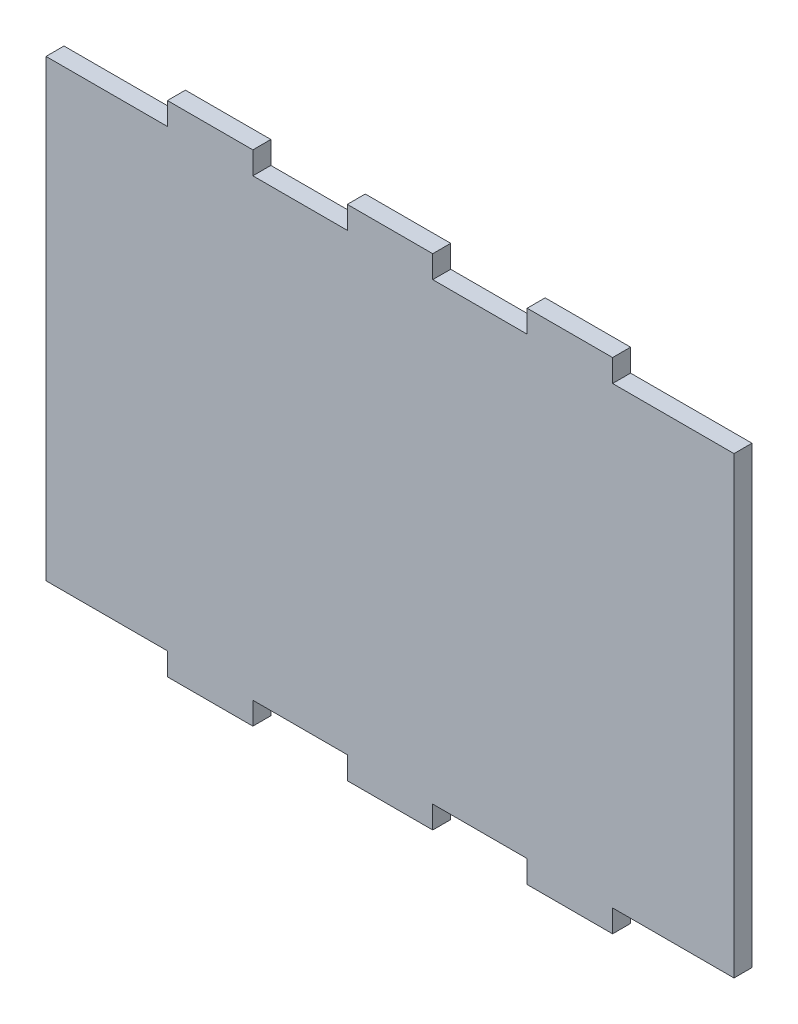
ISO-10303-21;
HEADER;
FILE_DESCRIPTION(('STEP AP214'),'2;1');
FILE_NAME('part.step','',(''),(''),'','','');
FILE_SCHEMA(('AUTOMOTIVE_DESIGN { 1 0 10303 214 1 1 1 1 }'));
ENDSEC;
DATA;
#1=APPLICATION_CONTEXT('core data for automotive mechanical design processes');
#2=APPLICATION_PROTOCOL_DEFINITION('international standard','automotive_design',2000,#1);
#3=PRODUCT_CONTEXT('',#1,'mechanical');
#4=PRODUCT('Part','Part','',(#3));
#5=PRODUCT_RELATED_PRODUCT_CATEGORY('part','',(#4));
#6=PRODUCT_DEFINITION_FORMATION('','',#4);
#7=PRODUCT_DEFINITION_CONTEXT('part definition',#1,'design');
#8=PRODUCT_DEFINITION('design','',#6,#7);
#9=PRODUCT_DEFINITION_SHAPE('','',#8);
#10=(LENGTH_UNIT() NAMED_UNIT(*) SI_UNIT(.MILLI.,.METRE.));
#11=(NAMED_UNIT(*) PLANE_ANGLE_UNIT() SI_UNIT($,.RADIAN.));
#12=(NAMED_UNIT(*) SI_UNIT($,.STERADIAN.) SOLID_ANGLE_UNIT());
#13=UNCERTAINTY_MEASURE_WITH_UNIT(LENGTH_MEASURE(1.E-05),#10,'distance_accuracy_value','');
#14=(GEOMETRIC_REPRESENTATION_CONTEXT(3) GLOBAL_UNCERTAINTY_ASSIGNED_CONTEXT((#13)) GLOBAL_UNIT_ASSIGNED_CONTEXT((#10,
#11,#12)) REPRESENTATION_CONTEXT('',''));
#15=CARTESIAN_POINT('',(0.,0.,0.));
#16=DIRECTION('',(0.,0.,1.));
#17=DIRECTION('',(1.,0.,0.));
#18=AXIS2_PLACEMENT_3D('',#15,#16,#17);
#19=CARTESIAN_POINT('',(-38.25,25.25,2.));
#20=DIRECTION('',(0.,1.,0.));
#21=DIRECTION('',(-1.,0.,0.));
#22=AXIS2_PLACEMENT_3D('',#19,#20,#21);
#23=PLANE('',#22);
#24=DIRECTION('',(1.,0.,0.));
#25=VECTOR('',#24,1.);
#26=CARTESIAN_POINT('',(-38.25,25.25,0.));
#27=LINE('',#26,#25);
#28=CARTESIAN_POINT('',(-38.25,25.25,0.));
#29=VERTEX_POINT('',#28);
#30=CARTESIAN_POINT('',(-24.75,25.25,0.));
#31=VERTEX_POINT('',#30);
#32=EDGE_CURVE('E251',#29,#31,#27,.T.);
#33=ORIENTED_EDGE('',*,*,#32,.F.);
#34=DIRECTION('',(0.,0.,-1.));
#35=VECTOR('',#34,1.);
#36=CARTESIAN_POINT('',(-38.25,25.25,2.));
#37=LINE('',#36,#35);
#38=CARTESIAN_POINT('',(-38.25,25.25,2.));
#39=VERTEX_POINT('',#38);
#40=EDGE_CURVE('E11',#39,#29,#37,.T.);
#41=ORIENTED_EDGE('',*,*,#40,.F.);
#42=DIRECTION('',(1.,0.,0.));
#43=VECTOR('',#42,1.);
#44=CARTESIAN_POINT('',(-38.25,25.25,2.));
#45=LINE('',#44,#43);
#46=CARTESIAN_POINT('',(-24.75,25.25,2.));
#47=VERTEX_POINT('',#46);
#48=EDGE_CURVE('E324',#39,#47,#45,.T.);
#49=ORIENTED_EDGE('',*,*,#48,.T.);
#50=DIRECTION('',(0.,0.,-1.));
#51=VECTOR('',#50,1.);
#52=CARTESIAN_POINT('',(-24.75,25.25,2.));
#53=LINE('',#52,#51);
#54=EDGE_CURVE('E36',#47,#31,#53,.T.);
#55=ORIENTED_EDGE('',*,*,#54,.T.);
#56=EDGE_LOOP('',(#33,#41,#49,#55));
#57=FACE_BOUND('',#56,.T.);
#58=ADVANCED_FACE('F33',(#57),#23,.T.);
#59=CARTESIAN_POINT('',(-38.25,25.25,2.));
#60=DIRECTION('',(1.,0.,0.));
#61=DIRECTION('',(0.,0.,-1.));
#62=AXIS2_PLACEMENT_3D('',#59,#60,#61);
#63=PLANE('',#62);
#64=DIRECTION('',(0.,-1.,0.));
#65=VECTOR('',#64,1.);
#66=CARTESIAN_POINT('',(-38.25,25.25,0.));
#67=LINE('',#66,#65);
#68=CARTESIAN_POINT('',(-38.25,-25.25,0.));
#69=VERTEX_POINT('',#68);
#70=EDGE_CURVE('E138',#29,#69,#67,.T.);
#71=ORIENTED_EDGE('',*,*,#70,.T.);
#72=DIRECTION('',(0.,0.,-1.));
#73=VECTOR('',#72,1.);
#74=CARTESIAN_POINT('',(-38.25,-25.25,2.));
#75=LINE('',#74,#73);
#76=CARTESIAN_POINT('',(-38.25,-25.25,2.));
#77=VERTEX_POINT('',#76);
#78=EDGE_CURVE('E42',#77,#69,#75,.T.);
#79=ORIENTED_EDGE('',*,*,#78,.F.);
#80=DIRECTION('',(0.,-1.,0.));
#81=VECTOR('',#80,1.);
#82=CARTESIAN_POINT('',(-38.25,25.25,2.));
#83=LINE('',#82,#81);
#84=EDGE_CURVE('E229',#39,#77,#83,.T.);
#85=ORIENTED_EDGE('',*,*,#84,.F.);
#86=ORIENTED_EDGE('',*,*,#40,.T.);
#87=EDGE_LOOP('',(#71,#79,#85,#86));
#88=FACE_BOUND('',#87,.T.);
#89=ADVANCED_FACE('F546',(#88),#63,.F.);
#90=CARTESIAN_POINT('',(-38.25,-25.25,2.));
#91=DIRECTION('',(0.,1.,0.));
#92=DIRECTION('',(-1.,0.,0.));
#93=AXIS2_PLACEMENT_3D('',#90,#91,#92);
#94=PLANE('',#93);
#95=DIRECTION('',(1.,0.,0.));
#96=VECTOR('',#95,1.);
#97=CARTESIAN_POINT('',(-38.25,-25.25,0.));
#98=LINE('',#97,#96);
#99=CARTESIAN_POINT('',(-24.75,-25.25,0.));
#100=VERTEX_POINT('',#99);
#101=EDGE_CURVE('E236',#69,#100,#98,.T.);
#102=ORIENTED_EDGE('',*,*,#101,.T.);
#103=DIRECTION('',(0.,0.,-1.));
#104=VECTOR('',#103,1.);
#105=CARTESIAN_POINT('',(-24.75,-25.25,2.));
#106=LINE('',#105,#104);
#107=CARTESIAN_POINT('',(-24.75,-25.25,2.));
#108=VERTEX_POINT('',#107);
#109=EDGE_CURVE('E233',#108,#100,#106,.T.);
#110=ORIENTED_EDGE('',*,*,#109,.F.);
#111=DIRECTION('',(1.,0.,0.));
#112=VECTOR('',#111,1.);
#113=CARTESIAN_POINT('',(-38.25,-25.25,2.));
#114=LINE('',#113,#112);
#115=EDGE_CURVE('E222',#77,#108,#114,.T.);
#116=ORIENTED_EDGE('',*,*,#115,.F.);
#117=ORIENTED_EDGE('',*,*,#78,.T.);
#118=EDGE_LOOP('',(#102,#110,#116,#117));
#119=FACE_BOUND('',#118,.T.);
#120=ADVANCED_FACE('F234',(#119),#94,.F.);
#121=CARTESIAN_POINT('',(-24.75,-25.25,2.));
#122=DIRECTION('',(1.,0.,0.));
#123=DIRECTION('',(0.,0.,-1.));
#124=AXIS2_PLACEMENT_3D('',#121,#122,#123);
#125=PLANE('',#124);
#126=DIRECTION('',(0.,-1.,0.));
#127=VECTOR('',#126,1.);
#128=CARTESIAN_POINT('',(-24.75,-25.25,0.));
#129=LINE('',#128,#127);
#130=CARTESIAN_POINT('',(-24.75,-27.75,0.));
#131=VERTEX_POINT('',#130);
#132=EDGE_CURVE('E321',#100,#131,#129,.T.);
#133=ORIENTED_EDGE('',*,*,#132,.T.);
#134=DIRECTION('',(0.,0.,-1.));
#135=VECTOR('',#134,1.);
#136=CARTESIAN_POINT('',(-24.75,-27.75,2.));
#137=LINE('',#136,#135);
#138=CARTESIAN_POINT('',(-24.75,-27.75,2.));
#139=VERTEX_POINT('',#138);
#140=EDGE_CURVE('E239',#139,#131,#137,.T.);
#141=ORIENTED_EDGE('',*,*,#140,.F.);
#142=DIRECTION('',(0.,-1.,0.));
#143=VECTOR('',#142,1.);
#144=CARTESIAN_POINT('',(-24.75,-25.25,2.));
#145=LINE('',#144,#143);
#146=EDGE_CURVE('E227',#108,#139,#145,.T.);
#147=ORIENTED_EDGE('',*,*,#146,.F.);
#148=ORIENTED_EDGE('',*,*,#109,.T.);
#149=EDGE_LOOP('',(#133,#141,#147,#148));
#150=FACE_BOUND('',#149,.T.);
#151=ADVANCED_FACE('F241',(#150),#125,.F.);
#152=CARTESIAN_POINT('',(-24.75,-27.75,2.));
#153=DIRECTION('',(0.,1.,0.));
#154=DIRECTION('',(-1.,0.,0.));
#155=AXIS2_PLACEMENT_3D('',#152,#153,#154);
#156=PLANE('',#155);
#157=DIRECTION('',(1.,0.,0.));
#158=VECTOR('',#157,1.);
#159=CARTESIAN_POINT('',(-24.75,-27.75,0.));
#160=LINE('',#159,#158);
#161=CARTESIAN_POINT('',(-15.25,-27.75,0.));
#162=VERTEX_POINT('',#161);
#163=EDGE_CURVE('E318',#131,#162,#160,.T.);
#164=ORIENTED_EDGE('',*,*,#163,.T.);
#165=DIRECTION('',(0.,0.,-1.));
#166=VECTOR('',#165,1.);
#167=CARTESIAN_POINT('',(-15.25,-27.75,2.));
#168=LINE('',#167,#166);
#169=CARTESIAN_POINT('',(-15.25,-27.75,2.));
#170=VERTEX_POINT('',#169);
#171=EDGE_CURVE('E328',#170,#162,#168,.T.);
#172=ORIENTED_EDGE('',*,*,#171,.F.);
#173=DIRECTION('',(1.,0.,0.));
#174=VECTOR('',#173,1.);
#175=CARTESIAN_POINT('',(-24.75,-27.75,2.));
#176=LINE('',#175,#174);
#177=EDGE_CURVE('E244',#139,#170,#176,.T.);
#178=ORIENTED_EDGE('',*,*,#177,.F.);
#179=ORIENTED_EDGE('',*,*,#140,.T.);
#180=EDGE_LOOP('',(#164,#172,#178,#179));
#181=FACE_BOUND('',#180,.T.);
#182=ADVANCED_FACE('F383',(#181),#156,.F.);
#183=CARTESIAN_POINT('',(-15.25,-25.25,2.));
#184=DIRECTION('',(1.,0.,0.));
#185=DIRECTION('',(0.,1.,0.));
#186=AXIS2_PLACEMENT_3D('',#183,#184,#185);
#187=PLANE('',#186);
#188=DIRECTION('',(0.,-1.,0.));
#189=VECTOR('',#188,1.);
#190=CARTESIAN_POINT('',(-15.25,-25.25,0.));
#191=LINE('',#190,#189);
#192=CARTESIAN_POINT('',(-15.25,-25.25,0.));
#193=VERTEX_POINT('',#192);
#194=EDGE_CURVE('E315',#193,#162,#191,.T.);
#195=ORIENTED_EDGE('',*,*,#194,.F.);
#196=DIRECTION('',(0.,0.,-1.));
#197=VECTOR('',#196,1.);
#198=CARTESIAN_POINT('',(-15.25,-25.25,2.));
#199=LINE('',#198,#197);
#200=CARTESIAN_POINT('',(-15.25,-25.25,2.));
#201=VERTEX_POINT('',#200);
#202=EDGE_CURVE('E330',#201,#193,#199,.T.);
#203=ORIENTED_EDGE('',*,*,#202,.F.);
#204=DIRECTION('',(0.,-1.,0.));
#205=VECTOR('',#204,1.);
#206=CARTESIAN_POINT('',(-15.25,-25.25,2.));
#207=LINE('',#206,#205);
#208=EDGE_CURVE('E246',#201,#170,#207,.T.);
#209=ORIENTED_EDGE('',*,*,#208,.T.);
#210=ORIENTED_EDGE('',*,*,#171,.T.);
#211=EDGE_LOOP('',(#195,#203,#209,#210));
#212=FACE_BOUND('',#211,.T.);
#213=ADVANCED_FACE('F536',(#212),#187,.T.);
#214=CARTESIAN_POINT('',(-15.25,-25.25,2.));
#215=DIRECTION('',(0.,1.,0.));
#216=DIRECTION('',(-1.,0.,0.));
#217=AXIS2_PLACEMENT_3D('',#214,#215,#216);
#218=PLANE('',#217);
#219=DIRECTION('',(1.,0.,0.));
#220=VECTOR('',#219,1.);
#221=CARTESIAN_POINT('',(-15.25,-25.25,0.));
#222=LINE('',#221,#220);
#223=CARTESIAN_POINT('',(-4.75,-25.25,0.));
#224=VERTEX_POINT('',#223);
#225=EDGE_CURVE('E313',#193,#224,#222,.T.);
#226=ORIENTED_EDGE('',*,*,#225,.T.);
#227=DIRECTION('',(0.,0.,-1.));
#228=VECTOR('',#227,1.);
#229=CARTESIAN_POINT('',(-4.75,-25.25,2.));
#230=LINE('',#229,#228);
#231=CARTESIAN_POINT('',(-4.75,-25.25,2.));
#232=VERTEX_POINT('',#231);
#233=EDGE_CURVE('E332',#232,#224,#230,.T.);
#234=ORIENTED_EDGE('',*,*,#233,.F.);
#235=DIRECTION('',(1.,0.,0.));
#236=VECTOR('',#235,1.);
#237=CARTESIAN_POINT('',(-15.25,-25.25,2.));
#238=LINE('',#237,#236);
#239=EDGE_CURVE('E388',#201,#232,#238,.T.);
#240=ORIENTED_EDGE('',*,*,#239,.F.);
#241=ORIENTED_EDGE('',*,*,#202,.T.);
#242=EDGE_LOOP('',(#226,#234,#240,#241));
#243=FACE_BOUND('',#242,.T.);
#244=ADVANCED_FACE('F534',(#243),#218,.F.);
#245=CARTESIAN_POINT('',(-4.75,-25.25,2.));
#246=DIRECTION('',(1.,0.,0.));
#247=DIRECTION('',(0.,0.,-1.));
#248=AXIS2_PLACEMENT_3D('',#245,#246,#247);
#249=PLANE('',#248);
#250=DIRECTION('',(0.,-1.,0.));
#251=VECTOR('',#250,1.);
#252=CARTESIAN_POINT('',(-4.75,-25.25,0.));
#253=LINE('',#252,#251);
#254=CARTESIAN_POINT('',(-4.75,-27.75,0.));
#255=VERTEX_POINT('',#254);
#256=EDGE_CURVE('E311',#224,#255,#253,.T.);
#257=ORIENTED_EDGE('',*,*,#256,.T.);
#258=DIRECTION('',(0.,0.,-1.));
#259=VECTOR('',#258,1.);
#260=CARTESIAN_POINT('',(-4.75,-27.75,2.));
#261=LINE('',#260,#259);
#262=CARTESIAN_POINT('',(-4.75,-27.75,2.));
#263=VERTEX_POINT('',#262);
#264=EDGE_CURVE('E335',#263,#255,#261,.T.);
#265=ORIENTED_EDGE('',*,*,#264,.F.);
#266=DIRECTION('',(0.,-1.,0.));
#267=VECTOR('',#266,1.);
#268=CARTESIAN_POINT('',(-4.75,-25.25,2.));
#269=LINE('',#268,#267);
#270=EDGE_CURVE('E391',#232,#263,#269,.T.);
#271=ORIENTED_EDGE('',*,*,#270,.F.);
#272=ORIENTED_EDGE('',*,*,#233,.T.);
#273=EDGE_LOOP('',(#257,#265,#271,#272));
#274=FACE_BOUND('',#273,.T.);
#275=ADVANCED_FACE('F532',(#274),#249,.F.);
#276=CARTESIAN_POINT('',(-4.75,-27.75,2.));
#277=DIRECTION('',(0.,1.,0.));
#278=DIRECTION('',(0.,0.,1.));
#279=AXIS2_PLACEMENT_3D('',#276,#277,#278);
#280=PLANE('',#279);
#281=DIRECTION('',(1.,0.,0.));
#282=VECTOR('',#281,1.);
#283=CARTESIAN_POINT('',(-4.75,-27.75,0.));
#284=LINE('',#283,#282);
#285=CARTESIAN_POINT('',(4.75,-27.75,0.));
#286=VERTEX_POINT('',#285);
#287=EDGE_CURVE('E308',#255,#286,#284,.T.);
#288=ORIENTED_EDGE('',*,*,#287,.T.);
#289=DIRECTION('',(0.,0.,-1.));
#290=VECTOR('',#289,1.);
#291=CARTESIAN_POINT('',(4.75,-27.75,2.));
#292=LINE('',#291,#290);
#293=CARTESIAN_POINT('',(4.75,-27.75,2.));
#294=VERTEX_POINT('',#293);
#295=EDGE_CURVE('E338',#294,#286,#292,.T.);
#296=ORIENTED_EDGE('',*,*,#295,.F.);
#297=DIRECTION('',(1.,0.,0.));
#298=VECTOR('',#297,1.);
#299=CARTESIAN_POINT('',(-4.75,-27.75,2.));
#300=LINE('',#299,#298);
#301=EDGE_CURVE('E395',#263,#294,#300,.T.);
#302=ORIENTED_EDGE('',*,*,#301,.F.);
#303=ORIENTED_EDGE('',*,*,#264,.T.);
#304=EDGE_LOOP('',(#288,#296,#302,#303));
#305=FACE_BOUND('',#304,.T.);
#306=ADVANCED_FACE('F527',(#305),#280,.F.);
#307=CARTESIAN_POINT('',(4.75,-25.25,2.));
#308=DIRECTION('',(1.,0.,0.));
#309=DIRECTION('',(0.,0.,-1.));
#310=AXIS2_PLACEMENT_3D('',#307,#308,#309);
#311=PLANE('',#310);
#312=DIRECTION('',(0.,-1.,0.));
#313=VECTOR('',#312,1.);
#314=CARTESIAN_POINT('',(4.75,-25.25,0.));
#315=LINE('',#314,#313);
#316=CARTESIAN_POINT('',(4.75,-25.25,0.));
#317=VERTEX_POINT('',#316);
#318=EDGE_CURVE('E305',#317,#286,#315,.T.);
#319=ORIENTED_EDGE('',*,*,#318,.F.);
#320=DIRECTION('',(0.,0.,-1.));
#321=VECTOR('',#320,1.);
#322=CARTESIAN_POINT('',(4.75,-25.25,2.));
#323=LINE('',#322,#321);
#324=CARTESIAN_POINT('',(4.75,-25.25,2.));
#325=VERTEX_POINT('',#324);
#326=EDGE_CURVE('E340',#325,#317,#323,.T.);
#327=ORIENTED_EDGE('',*,*,#326,.F.);
#328=DIRECTION('',(0.,-1.,0.));
#329=VECTOR('',#328,1.);
#330=CARTESIAN_POINT('',(4.75,-25.25,2.));
#331=LINE('',#330,#329);
#332=EDGE_CURVE('E397',#325,#294,#331,.T.);
#333=ORIENTED_EDGE('',*,*,#332,.T.);
#334=ORIENTED_EDGE('',*,*,#295,.T.);
#335=EDGE_LOOP('',(#319,#327,#333,#334));
#336=FACE_BOUND('',#335,.T.);
#337=ADVANCED_FACE('F521',(#336),#311,.T.);
#338=CARTESIAN_POINT('',(4.75,-25.25,2.));
#339=DIRECTION('',(0.,1.,0.));
#340=DIRECTION('',(0.,0.,1.));
#341=AXIS2_PLACEMENT_3D('',#338,#339,#340);
#342=PLANE('',#341);
#343=DIRECTION('',(1.,0.,0.));
#344=VECTOR('',#343,1.);
#345=CARTESIAN_POINT('',(4.75,-25.25,0.));
#346=LINE('',#345,#344);
#347=CARTESIAN_POINT('',(15.25,-25.25,0.));
#348=VERTEX_POINT('',#347);
#349=EDGE_CURVE('E303',#317,#348,#346,.T.);
#350=ORIENTED_EDGE('',*,*,#349,.T.);
#351=DIRECTION('',(0.,0.,-1.));
#352=VECTOR('',#351,1.);
#353=CARTESIAN_POINT('',(15.25,-25.25,2.));
#354=LINE('',#353,#352);
#355=CARTESIAN_POINT('',(15.25,-25.25,2.));
#356=VERTEX_POINT('',#355);
#357=EDGE_CURVE('E342',#356,#348,#354,.T.);
#358=ORIENTED_EDGE('',*,*,#357,.F.);
#359=DIRECTION('',(1.,0.,0.));
#360=VECTOR('',#359,1.);
#361=CARTESIAN_POINT('',(4.75,-25.25,2.));
#362=LINE('',#361,#360);
#363=EDGE_CURVE('E400',#325,#356,#362,.T.);
#364=ORIENTED_EDGE('',*,*,#363,.F.);
#365=ORIENTED_EDGE('',*,*,#326,.T.);
#366=EDGE_LOOP('',(#350,#358,#364,#365));
#367=FACE_BOUND('',#366,.T.);
#368=ADVANCED_FACE('F518',(#367),#342,.F.);
#369=CARTESIAN_POINT('',(15.25,-25.25,2.));
#370=DIRECTION('',(1.,0.,0.));
#371=DIRECTION('',(0.,0.,-1.));
#372=AXIS2_PLACEMENT_3D('',#369,#370,#371);
#373=PLANE('',#372);
#374=DIRECTION('',(0.,-1.,0.));
#375=VECTOR('',#374,1.);
#376=CARTESIAN_POINT('',(15.25,-25.25,0.));
#377=LINE('',#376,#375);
#378=CARTESIAN_POINT('',(15.25,-27.75,0.));
#379=VERTEX_POINT('',#378);
#380=EDGE_CURVE('E301',#348,#379,#377,.T.);
#381=ORIENTED_EDGE('',*,*,#380,.T.);
#382=DIRECTION('',(0.,0.,-1.));
#383=VECTOR('',#382,1.);
#384=CARTESIAN_POINT('',(15.25,-27.75,2.));
#385=LINE('',#384,#383);
#386=CARTESIAN_POINT('',(15.25,-27.75,2.));
#387=VERTEX_POINT('',#386);
#388=EDGE_CURVE('E345',#387,#379,#385,.T.);
#389=ORIENTED_EDGE('',*,*,#388,.F.);
#390=DIRECTION('',(0.,-1.,0.));
#391=VECTOR('',#390,1.);
#392=CARTESIAN_POINT('',(15.25,-25.25,2.));
#393=LINE('',#392,#391);
#394=EDGE_CURVE('E402',#356,#387,#393,.T.);
#395=ORIENTED_EDGE('',*,*,#394,.F.);
#396=ORIENTED_EDGE('',*,*,#357,.T.);
#397=EDGE_LOOP('',(#381,#389,#395,#396));
#398=FACE_BOUND('',#397,.T.);
#399=ADVANCED_FACE('F513',(#398),#373,.F.);
#400=CARTESIAN_POINT('',(15.25,-27.75,2.));
#401=DIRECTION('',(0.,1.,0.));
#402=DIRECTION('',(-1.,0.,0.));
#403=AXIS2_PLACEMENT_3D('',#400,#401,#402);
#404=PLANE('',#403);
#405=DIRECTION('',(1.,0.,0.));
#406=VECTOR('',#405,1.);
#407=CARTESIAN_POINT('',(15.25,-27.75,0.));
#408=LINE('',#407,#406);
#409=CARTESIAN_POINT('',(24.75,-27.75,0.));
#410=VERTEX_POINT('',#409);
#411=EDGE_CURVE('E298',#379,#410,#408,.T.);
#412=ORIENTED_EDGE('',*,*,#411,.T.);
#413=DIRECTION('',(0.,0.,-1.));
#414=VECTOR('',#413,1.);
#415=CARTESIAN_POINT('',(24.75,-27.75,2.));
#416=LINE('',#415,#414);
#417=CARTESIAN_POINT('',(24.75,-27.75,2.));
#418=VERTEX_POINT('',#417);
#419=EDGE_CURVE('E348',#418,#410,#416,.T.);
#420=ORIENTED_EDGE('',*,*,#419,.F.);
#421=DIRECTION('',(1.,0.,0.));
#422=VECTOR('',#421,1.);
#423=CARTESIAN_POINT('',(15.25,-27.75,2.));
#424=LINE('',#423,#422);
#425=EDGE_CURVE('E404',#387,#418,#424,.T.);
#426=ORIENTED_EDGE('',*,*,#425,.F.);
#427=ORIENTED_EDGE('',*,*,#388,.T.);
#428=EDGE_LOOP('',(#412,#420,#426,#427));
#429=FACE_BOUND('',#428,.T.);
#430=ADVANCED_FACE('F507',(#429),#404,.F.);
#431=CARTESIAN_POINT('',(24.75,-25.25,2.));
#432=DIRECTION('',(1.,0.,0.));
#433=DIRECTION('',(0.,0.,-1.));
#434=AXIS2_PLACEMENT_3D('',#431,#432,#433);
#435=PLANE('',#434);
#436=DIRECTION('',(0.,-1.,0.));
#437=VECTOR('',#436,1.);
#438=CARTESIAN_POINT('',(24.75,-25.25,0.));
#439=LINE('',#438,#437);
#440=CARTESIAN_POINT('',(24.75,-25.25,0.));
#441=VERTEX_POINT('',#440);
#442=EDGE_CURVE('E295',#441,#410,#439,.T.);
#443=ORIENTED_EDGE('',*,*,#442,.F.);
#444=DIRECTION('',(0.,0.,-1.));
#445=VECTOR('',#444,1.);
#446=CARTESIAN_POINT('',(24.75,-25.25,2.));
#447=LINE('',#446,#445);
#448=CARTESIAN_POINT('',(24.75,-25.25,2.));
#449=VERTEX_POINT('',#448);
#450=EDGE_CURVE('E350',#449,#441,#447,.T.);
#451=ORIENTED_EDGE('',*,*,#450,.F.);
#452=DIRECTION('',(0.,-1.,0.));
#453=VECTOR('',#452,1.);
#454=CARTESIAN_POINT('',(24.75,-25.25,2.));
#455=LINE('',#454,#453);
#456=EDGE_CURVE('E406',#449,#418,#455,.T.);
#457=ORIENTED_EDGE('',*,*,#456,.T.);
#458=ORIENTED_EDGE('',*,*,#419,.T.);
#459=EDGE_LOOP('',(#443,#451,#457,#458));
#460=FACE_BOUND('',#459,.T.);
#461=ADVANCED_FACE('F501',(#460),#435,.T.);
#462=CARTESIAN_POINT('',(24.75,-25.25,2.));
#463=DIRECTION('',(0.,1.,0.));
#464=DIRECTION('',(0.,0.,1.));
#465=AXIS2_PLACEMENT_3D('',#462,#463,#464);
#466=PLANE('',#465);
#467=DIRECTION('',(1.,0.,0.));
#468=VECTOR('',#467,1.);
#469=CARTESIAN_POINT('',(24.75,-25.25,0.));
#470=LINE('',#469,#468);
#471=CARTESIAN_POINT('',(38.25,-25.25,0.));
#472=VERTEX_POINT('',#471);
#473=EDGE_CURVE('E292',#441,#472,#470,.T.);
#474=ORIENTED_EDGE('',*,*,#473,.T.);
#475=DIRECTION('',(0.,0.,-1.));
#476=VECTOR('',#475,1.);
#477=CARTESIAN_POINT('',(38.25,-25.25,2.));
#478=LINE('',#477,#476);
#479=CARTESIAN_POINT('',(38.25,-25.25,2.));
#480=VERTEX_POINT('',#479);
#481=EDGE_CURVE('E352',#480,#472,#478,.T.);
#482=ORIENTED_EDGE('',*,*,#481,.F.);
#483=DIRECTION('',(1.,0.,0.));
#484=VECTOR('',#483,1.);
#485=CARTESIAN_POINT('',(24.75,-25.25,2.));
#486=LINE('',#485,#484);
#487=EDGE_CURVE('E409',#449,#480,#486,.T.);
#488=ORIENTED_EDGE('',*,*,#487,.F.);
#489=ORIENTED_EDGE('',*,*,#450,.T.);
#490=EDGE_LOOP('',(#474,#482,#488,#489));
#491=FACE_BOUND('',#490,.T.);
#492=ADVANCED_FACE('F634',(#491),#466,.F.);
#493=CARTESIAN_POINT('',(38.25,25.25,2.));
#494=DIRECTION('',(1.,0.,0.));
#495=DIRECTION('',(0.,1.,0.));
#496=AXIS2_PLACEMENT_3D('',#493,#494,#495);
#497=PLANE('',#496);
#498=DIRECTION('',(0.,-1.,0.));
#499=VECTOR('',#498,1.);
#500=CARTESIAN_POINT('',(38.25,25.25,0.));
#501=LINE('',#500,#499);
#502=CARTESIAN_POINT('',(38.25,25.25,0.));
#503=VERTEX_POINT('',#502);
#504=EDGE_CURVE('E289',#503,#472,#501,.T.);
#505=ORIENTED_EDGE('',*,*,#504,.F.);
#506=DIRECTION('',(0.,0.,-1.));
#507=VECTOR('',#506,1.);
#508=CARTESIAN_POINT('',(38.25,25.25,2.));
#509=LINE('',#508,#507);
#510=CARTESIAN_POINT('',(38.25,25.25,2.));
#511=VERTEX_POINT('',#510);
#512=EDGE_CURVE('E354',#511,#503,#509,.T.);
#513=ORIENTED_EDGE('',*,*,#512,.F.);
#514=DIRECTION('',(0.,-1.,0.));
#515=VECTOR('',#514,1.);
#516=CARTESIAN_POINT('',(38.25,25.25,2.));
#517=LINE('',#516,#515);
#518=EDGE_CURVE('E411',#511,#480,#517,.T.);
#519=ORIENTED_EDGE('',*,*,#518,.T.);
#520=ORIENTED_EDGE('',*,*,#481,.T.);
#521=EDGE_LOOP('',(#505,#513,#519,#520));
#522=FACE_BOUND('',#521,.T.);
#523=ADVANCED_FACE('F494',(#522),#497,.T.);
#524=CARTESIAN_POINT('',(24.75,25.25,2.));
#525=DIRECTION('',(0.,1.,0.));
#526=DIRECTION('',(-1.,0.,0.));
#527=AXIS2_PLACEMENT_3D('',#524,#525,#526);
#528=PLANE('',#527);
#529=DIRECTION('',(1.,0.,0.));
#530=VECTOR('',#529,1.);
#531=CARTESIAN_POINT('',(24.75,25.25,0.));
#532=LINE('',#531,#530);
#533=CARTESIAN_POINT('',(24.75,25.25,0.));
#534=VERTEX_POINT('',#533);
#535=EDGE_CURVE('E286',#534,#503,#532,.T.);
#536=ORIENTED_EDGE('',*,*,#535,.F.);
#537=DIRECTION('',(0.,0.,-1.));
#538=VECTOR('',#537,1.);
#539=CARTESIAN_POINT('',(24.75,25.25,2.));
#540=LINE('',#539,#538);
#541=CARTESIAN_POINT('',(24.75,25.25,2.));
#542=VERTEX_POINT('',#541);
#543=EDGE_CURVE('E356',#542,#534,#540,.T.);
#544=ORIENTED_EDGE('',*,*,#543,.F.);
#545=DIRECTION('',(1.,0.,0.));
#546=VECTOR('',#545,1.);
#547=CARTESIAN_POINT('',(24.75,25.25,2.));
#548=LINE('',#547,#546);
#549=EDGE_CURVE('E414',#542,#511,#548,.T.);
#550=ORIENTED_EDGE('',*,*,#549,.T.);
#551=ORIENTED_EDGE('',*,*,#512,.T.);
#552=EDGE_LOOP('',(#536,#544,#550,#551));
#553=FACE_BOUND('',#552,.T.);
#554=ADVANCED_FACE('F489',(#553),#528,.T.);
#555=CARTESIAN_POINT('',(24.75,25.25,2.));
#556=DIRECTION('',(-1.,0.,0.));
#557=DIRECTION('',(0.,0.,1.));
#558=AXIS2_PLACEMENT_3D('',#555,#556,#557);
#559=PLANE('',#558);
#560=DIRECTION('',(0.,1.,0.));
#561=VECTOR('',#560,1.);
#562=CARTESIAN_POINT('',(24.75,25.25,0.));
#563=LINE('',#562,#561);
#564=CARTESIAN_POINT('',(24.75,27.75,0.));
#565=VERTEX_POINT('',#564);
#566=EDGE_CURVE('E283',#534,#565,#563,.T.);
#567=ORIENTED_EDGE('',*,*,#566,.T.);
#568=DIRECTION('',(0.,0.,-1.));
#569=VECTOR('',#568,1.);
#570=CARTESIAN_POINT('',(24.75,27.75,2.));
#571=LINE('',#570,#569);
#572=CARTESIAN_POINT('',(24.75,27.75,2.));
#573=VERTEX_POINT('',#572);
#574=EDGE_CURVE('E358',#573,#565,#571,.T.);
#575=ORIENTED_EDGE('',*,*,#574,.F.);
#576=DIRECTION('',(0.,1.,0.));
#577=VECTOR('',#576,1.);
#578=CARTESIAN_POINT('',(24.75,25.25,2.));
#579=LINE('',#578,#577);
#580=EDGE_CURVE('E417',#542,#573,#579,.T.);
#581=ORIENTED_EDGE('',*,*,#580,.F.);
#582=ORIENTED_EDGE('',*,*,#543,.T.);
#583=EDGE_LOOP('',(#567,#575,#581,#582));
#584=FACE_BOUND('',#583,.T.);
#585=ADVANCED_FACE('F486',(#584),#559,.F.);
#586=CARTESIAN_POINT('',(15.25,27.75,2.));
#587=DIRECTION('',(0.,1.,0.));
#588=DIRECTION('',(-1.,0.,0.));
#589=AXIS2_PLACEMENT_3D('',#586,#587,#588);
#590=PLANE('',#589);
#591=DIRECTION('',(1.,0.,0.));
#592=VECTOR('',#591,1.);
#593=CARTESIAN_POINT('',(15.25,27.75,0.));
#594=LINE('',#593,#592);
#595=CARTESIAN_POINT('',(15.25,27.75,0.));
#596=VERTEX_POINT('',#595);
#597=EDGE_CURVE('E280',#596,#565,#594,.T.);
#598=ORIENTED_EDGE('',*,*,#597,.F.);
#599=DIRECTION('',(0.,0.,-1.));
#600=VECTOR('',#599,1.);
#601=CARTESIAN_POINT('',(15.25,27.75,2.));
#602=LINE('',#601,#600);
#603=CARTESIAN_POINT('',(15.25,27.75,2.));
#604=VERTEX_POINT('',#603);
#605=EDGE_CURVE('E360',#604,#596,#602,.T.);
#606=ORIENTED_EDGE('',*,*,#605,.F.);
#607=DIRECTION('',(1.,0.,0.));
#608=VECTOR('',#607,1.);
#609=CARTESIAN_POINT('',(15.25,27.75,2.));
#610=LINE('',#609,#608);
#611=EDGE_CURVE('E419',#604,#573,#610,.T.);
#612=ORIENTED_EDGE('',*,*,#611,.T.);
#613=ORIENTED_EDGE('',*,*,#574,.T.);
#614=EDGE_LOOP('',(#598,#606,#612,#613));
#615=FACE_BOUND('',#614,.T.);
#616=ADVANCED_FACE('F482',(#615),#590,.T.);
#617=CARTESIAN_POINT('',(15.25,25.25,2.));
#618=DIRECTION('',(-1.,0.,0.));
#619=DIRECTION('',(0.,0.,1.));
#620=AXIS2_PLACEMENT_3D('',#617,#618,#619);
#621=PLANE('',#620);
#622=DIRECTION('',(0.,1.,0.));
#623=VECTOR('',#622,1.);
#624=CARTESIAN_POINT('',(15.25,25.25,0.));
#625=LINE('',#624,#623);
#626=CARTESIAN_POINT('',(15.25,25.25,0.));
#627=VERTEX_POINT('',#626);
#628=EDGE_CURVE('E277',#627,#596,#625,.T.);
#629=ORIENTED_EDGE('',*,*,#628,.F.);
#630=DIRECTION('',(0.,0.,-1.));
#631=VECTOR('',#630,1.);
#632=CARTESIAN_POINT('',(15.25,25.25,2.));
#633=LINE('',#632,#631);
#634=CARTESIAN_POINT('',(15.25,25.25,2.));
#635=VERTEX_POINT('',#634);
#636=EDGE_CURVE('E362',#635,#627,#633,.T.);
#637=ORIENTED_EDGE('',*,*,#636,.F.);
#638=DIRECTION('',(0.,1.,0.));
#639=VECTOR('',#638,1.);
#640=CARTESIAN_POINT('',(15.25,25.25,2.));
#641=LINE('',#640,#639);
#642=EDGE_CURVE('E422',#635,#604,#641,.T.);
#643=ORIENTED_EDGE('',*,*,#642,.T.);
#644=ORIENTED_EDGE('',*,*,#605,.T.);
#645=EDGE_LOOP('',(#629,#637,#643,#644));
#646=FACE_BOUND('',#645,.T.);
#647=ADVANCED_FACE('F478',(#646),#621,.T.);
#648=CARTESIAN_POINT('',(4.75,25.25,2.));
#649=DIRECTION('',(0.,1.,0.));
#650=DIRECTION('',(-1.,0.,0.));
#651=AXIS2_PLACEMENT_3D('',#648,#649,#650);
#652=PLANE('',#651);
#653=DIRECTION('',(1.,0.,0.));
#654=VECTOR('',#653,1.);
#655=CARTESIAN_POINT('',(4.75,25.25,0.));
#656=LINE('',#655,#654);
#657=CARTESIAN_POINT('',(4.75,25.25,0.));
#658=VERTEX_POINT('',#657);
#659=EDGE_CURVE('E274',#658,#627,#656,.T.);
#660=ORIENTED_EDGE('',*,*,#659,.F.);
#661=DIRECTION('',(0.,0.,-1.));
#662=VECTOR('',#661,1.);
#663=CARTESIAN_POINT('',(4.75,25.25,2.));
#664=LINE('',#663,#662);
#665=CARTESIAN_POINT('',(4.75,25.25,2.));
#666=VERTEX_POINT('',#665);
#667=EDGE_CURVE('E364',#666,#658,#664,.T.);
#668=ORIENTED_EDGE('',*,*,#667,.F.);
#669=DIRECTION('',(1.,0.,0.));
#670=VECTOR('',#669,1.);
#671=CARTESIAN_POINT('',(4.75,25.25,2.));
#672=LINE('',#671,#670);
#673=EDGE_CURVE('E425',#666,#635,#672,.T.);
#674=ORIENTED_EDGE('',*,*,#673,.T.);
#675=ORIENTED_EDGE('',*,*,#636,.T.);
#676=EDGE_LOOP('',(#660,#668,#674,#675));
#677=FACE_BOUND('',#676,.T.);
#678=ADVANCED_FACE('F473',(#677),#652,.T.);
#679=CARTESIAN_POINT('',(4.75,25.25,2.));
#680=DIRECTION('',(-1.,0.,0.));
#681=DIRECTION('',(0.,-1.,0.));
#682=AXIS2_PLACEMENT_3D('',#679,#680,#681);
#683=PLANE('',#682);
#684=DIRECTION('',(0.,1.,0.));
#685=VECTOR('',#684,1.);
#686=CARTESIAN_POINT('',(4.75,25.25,0.));
#687=LINE('',#686,#685);
#688=CARTESIAN_POINT('',(4.75,27.75,0.));
#689=VERTEX_POINT('',#688);
#690=EDGE_CURVE('E272',#658,#689,#687,.T.);
#691=ORIENTED_EDGE('',*,*,#690,.T.);
#692=DIRECTION('',(0.,0.,-1.));
#693=VECTOR('',#692,1.);
#694=CARTESIAN_POINT('',(4.75,27.75,2.));
#695=LINE('',#694,#693);
#696=CARTESIAN_POINT('',(4.75,27.75,2.));
#697=VERTEX_POINT('',#696);
#698=EDGE_CURVE('E366',#697,#689,#695,.T.);
#699=ORIENTED_EDGE('',*,*,#698,.F.);
#700=DIRECTION('',(0.,1.,0.));
#701=VECTOR('',#700,1.);
#702=CARTESIAN_POINT('',(4.75,25.25,2.));
#703=LINE('',#702,#701);
#704=EDGE_CURVE('E428',#666,#697,#703,.T.);
#705=ORIENTED_EDGE('',*,*,#704,.F.);
#706=ORIENTED_EDGE('',*,*,#667,.T.);
#707=EDGE_LOOP('',(#691,#699,#705,#706));
#708=FACE_BOUND('',#707,.T.);
#709=ADVANCED_FACE('F470',(#708),#683,.F.);
#710=CARTESIAN_POINT('',(4.75,27.75,2.));
#711=DIRECTION('',(0.,-1.,0.));
#712=DIRECTION('',(0.,0.,-1.));
#713=AXIS2_PLACEMENT_3D('',#710,#711,#712);
#714=PLANE('',#713);
#715=DIRECTION('',(-1.,0.,0.));
#716=VECTOR('',#715,1.);
#717=CARTESIAN_POINT('',(4.75,27.75,0.));
#718=LINE('',#717,#716);
#719=CARTESIAN_POINT('',(-4.75,27.75,0.));
#720=VERTEX_POINT('',#719);
#721=EDGE_CURVE('E269',#689,#720,#718,.T.);
#722=ORIENTED_EDGE('',*,*,#721,.T.);
#723=DIRECTION('',(0.,0.,-1.));
#724=VECTOR('',#723,1.);
#725=CARTESIAN_POINT('',(-4.75,27.75,2.));
#726=LINE('',#725,#724);
#727=CARTESIAN_POINT('',(-4.75,27.75,2.));
#728=VERTEX_POINT('',#727);
#729=EDGE_CURVE('E369',#728,#720,#726,.T.);
#730=ORIENTED_EDGE('',*,*,#729,.F.);
#731=DIRECTION('',(-1.,0.,0.));
#732=VECTOR('',#731,1.);
#733=CARTESIAN_POINT('',(4.75,27.75,2.));
#734=LINE('',#733,#732);
#735=EDGE_CURVE('E430',#697,#728,#734,.T.);
#736=ORIENTED_EDGE('',*,*,#735,.F.);
#737=ORIENTED_EDGE('',*,*,#698,.T.);
#738=EDGE_LOOP('',(#722,#730,#736,#737));
#739=FACE_BOUND('',#738,.T.);
#740=ADVANCED_FACE('F465',(#739),#714,.F.);
#741=CARTESIAN_POINT('',(-4.75,25.25,2.));
#742=DIRECTION('',(-1.,0.,0.));
#743=DIRECTION('',(0.,-1.,0.));
#744=AXIS2_PLACEMENT_3D('',#741,#742,#743);
#745=PLANE('',#744);
#746=DIRECTION('',(0.,1.,0.));
#747=VECTOR('',#746,1.);
#748=CARTESIAN_POINT('',(-4.75,25.25,0.));
#749=LINE('',#748,#747);
#750=CARTESIAN_POINT('',(-4.75,25.25,0.));
#751=VERTEX_POINT('',#750);
#752=EDGE_CURVE('E266',#751,#720,#749,.T.);
#753=ORIENTED_EDGE('',*,*,#752,.F.);
#754=DIRECTION('',(0.,0.,-1.));
#755=VECTOR('',#754,1.);
#756=CARTESIAN_POINT('',(-4.75,25.25,2.));
#757=LINE('',#756,#755);
#758=CARTESIAN_POINT('',(-4.75,25.25,2.));
#759=VERTEX_POINT('',#758);
#760=EDGE_CURVE('E371',#759,#751,#757,.T.);
#761=ORIENTED_EDGE('',*,*,#760,.F.);
#762=DIRECTION('',(0.,1.,0.));
#763=VECTOR('',#762,1.);
#764=CARTESIAN_POINT('',(-4.75,25.25,2.));
#765=LINE('',#764,#763);
#766=EDGE_CURVE('E432',#759,#728,#765,.T.);
#767=ORIENTED_EDGE('',*,*,#766,.T.);
#768=ORIENTED_EDGE('',*,*,#729,.T.);
#769=EDGE_LOOP('',(#753,#761,#767,#768));
#770=FACE_BOUND('',#769,.T.);
#771=ADVANCED_FACE('F459',(#770),#745,.T.);
#772=CARTESIAN_POINT('',(-15.25,25.25,2.));
#773=DIRECTION('',(0.,1.,0.));
#774=DIRECTION('',(-1.,0.,0.));
#775=AXIS2_PLACEMENT_3D('',#772,#773,#774);
#776=PLANE('',#775);
#777=DIRECTION('',(1.,0.,0.));
#778=VECTOR('',#777,1.);
#779=CARTESIAN_POINT('',(-15.25,25.25,0.));
#780=LINE('',#779,#778);
#781=CARTESIAN_POINT('',(-15.25,25.25,0.));
#782=VERTEX_POINT('',#781);
#783=EDGE_CURVE('E263',#782,#751,#780,.T.);
#784=ORIENTED_EDGE('',*,*,#783,.F.);
#785=DIRECTION('',(0.,0.,-1.));
#786=VECTOR('',#785,1.);
#787=CARTESIAN_POINT('',(-15.25,25.25,2.));
#788=LINE('',#787,#786);
#789=CARTESIAN_POINT('',(-15.25,25.25,2.));
#790=VERTEX_POINT('',#789);
#791=EDGE_CURVE('E373',#790,#782,#788,.T.);
#792=ORIENTED_EDGE('',*,*,#791,.F.);
#793=DIRECTION('',(1.,0.,0.));
#794=VECTOR('',#793,1.);
#795=CARTESIAN_POINT('',(-15.25,25.25,2.));
#796=LINE('',#795,#794);
#797=EDGE_CURVE('E435',#790,#759,#796,.T.);
#798=ORIENTED_EDGE('',*,*,#797,.T.);
#799=ORIENTED_EDGE('',*,*,#760,.T.);
#800=EDGE_LOOP('',(#784,#792,#798,#799));
#801=FACE_BOUND('',#800,.T.);
#802=ADVANCED_FACE('F455',(#801),#776,.T.);
#803=CARTESIAN_POINT('',(-15.25,25.25,2.));
#804=DIRECTION('',(-1.,0.,0.));
#805=DIRECTION('',(0.,-1.,0.));
#806=AXIS2_PLACEMENT_3D('',#803,#804,#805);
#807=PLANE('',#806);
#808=DIRECTION('',(0.,1.,0.));
#809=VECTOR('',#808,1.);
#810=CARTESIAN_POINT('',(-15.25,25.25,0.));
#811=LINE('',#810,#809);
#812=CARTESIAN_POINT('',(-15.25,27.75,0.));
#813=VERTEX_POINT('',#812);
#814=EDGE_CURVE('E260',#782,#813,#811,.T.);
#815=ORIENTED_EDGE('',*,*,#814,.T.);
#816=DIRECTION('',(0.,0.,-1.));
#817=VECTOR('',#816,1.);
#818=CARTESIAN_POINT('',(-15.25,27.75,2.));
#819=LINE('',#818,#817);
#820=CARTESIAN_POINT('',(-15.25,27.75,2.));
#821=VERTEX_POINT('',#820);
#822=EDGE_CURVE('E375',#821,#813,#819,.T.);
#823=ORIENTED_EDGE('',*,*,#822,.F.);
#824=DIRECTION('',(0.,1.,0.));
#825=VECTOR('',#824,1.);
#826=CARTESIAN_POINT('',(-15.25,25.25,2.));
#827=LINE('',#826,#825);
#828=EDGE_CURVE('E438',#790,#821,#827,.T.);
#829=ORIENTED_EDGE('',*,*,#828,.F.);
#830=ORIENTED_EDGE('',*,*,#791,.T.);
#831=EDGE_LOOP('',(#815,#823,#829,#830));
#832=FACE_BOUND('',#831,.T.);
#833=ADVANCED_FACE('F723',(#832),#807,.F.);
#834=CARTESIAN_POINT('',(-24.75,27.75,2.));
#835=DIRECTION('',(0.,1.,0.));
#836=DIRECTION('',(-1.,0.,0.));
#837=AXIS2_PLACEMENT_3D('',#834,#835,#836);
#838=PLANE('',#837);
#839=DIRECTION('',(1.,0.,0.));
#840=VECTOR('',#839,1.);
#841=CARTESIAN_POINT('',(-24.75,27.75,0.));
#842=LINE('',#841,#840);
#843=CARTESIAN_POINT('',(-24.75,27.75,0.));
#844=VERTEX_POINT('',#843);
#845=EDGE_CURVE('E257',#844,#813,#842,.T.);
#846=ORIENTED_EDGE('',*,*,#845,.F.);
#847=DIRECTION('',(0.,0.,-1.));
#848=VECTOR('',#847,1.);
#849=CARTESIAN_POINT('',(-24.75,27.75,2.));
#850=LINE('',#849,#848);
#851=CARTESIAN_POINT('',(-24.75,27.75,2.));
#852=VERTEX_POINT('',#851);
#853=EDGE_CURVE('E376',#852,#844,#850,.T.);
#854=ORIENTED_EDGE('',*,*,#853,.F.);
#855=DIRECTION('',(1.,0.,0.));
#856=VECTOR('',#855,1.);
#857=CARTESIAN_POINT('',(-24.75,27.75,2.));
#858=LINE('',#857,#856);
#859=EDGE_CURVE('E440',#852,#821,#858,.T.);
#860=ORIENTED_EDGE('',*,*,#859,.T.);
#861=ORIENTED_EDGE('',*,*,#822,.T.);
#862=EDGE_LOOP('',(#846,#854,#860,#861));
#863=FACE_BOUND('',#862,.T.);
#864=ADVANCED_FACE('F450',(#863),#838,.T.);
#865=CARTESIAN_POINT('',(-24.75,25.25,2.));
#866=DIRECTION('',(-1.,0.,0.));
#867=DIRECTION('',(0.,0.,1.));
#868=AXIS2_PLACEMENT_3D('',#865,#866,#867);
#869=PLANE('',#868);
#870=DIRECTION('',(0.,1.,0.));
#871=VECTOR('',#870,1.);
#872=CARTESIAN_POINT('',(-24.75,25.25,0.));
#873=LINE('',#872,#871);
#874=EDGE_CURVE('E254',#31,#844,#873,.T.);
#875=ORIENTED_EDGE('',*,*,#874,.F.);
#876=ORIENTED_EDGE('',*,*,#54,.F.);
#877=DIRECTION('',(0.,1.,0.));
#878=VECTOR('',#877,1.);
#879=CARTESIAN_POINT('',(-24.75,25.25,2.));
#880=LINE('',#879,#878);
#881=EDGE_CURVE('E443',#47,#852,#880,.T.);
#882=ORIENTED_EDGE('',*,*,#881,.T.);
#883=ORIENTED_EDGE('',*,*,#853,.T.);
#884=EDGE_LOOP('',(#875,#876,#882,#883));
#885=FACE_BOUND('',#884,.T.);
#886=ADVANCED_FACE('F378',(#885),#869,.T.);
#887=CARTESIAN_POINT('',(0.,0.,2.));
#888=DIRECTION('',(0.,0.,1.));
#889=DIRECTION('',(1.,0.,0.));
#890=AXIS2_PLACEMENT_3D('',#887,#888,#889);
#891=PLANE('',#890);
#892=ORIENTED_EDGE('',*,*,#48,.F.);
#893=ORIENTED_EDGE('',*,*,#84,.T.);
#894=ORIENTED_EDGE('',*,*,#115,.T.);
#895=ORIENTED_EDGE('',*,*,#146,.T.);
#896=ORIENTED_EDGE('',*,*,#177,.T.);
#897=ORIENTED_EDGE('',*,*,#208,.F.);
#898=ORIENTED_EDGE('',*,*,#239,.T.);
#899=ORIENTED_EDGE('',*,*,#270,.T.);
#900=ORIENTED_EDGE('',*,*,#301,.T.);
#901=ORIENTED_EDGE('',*,*,#332,.F.);
#902=ORIENTED_EDGE('',*,*,#363,.T.);
#903=ORIENTED_EDGE('',*,*,#394,.T.);
#904=ORIENTED_EDGE('',*,*,#425,.T.);
#905=ORIENTED_EDGE('',*,*,#456,.F.);
#906=ORIENTED_EDGE('',*,*,#487,.T.);
#907=ORIENTED_EDGE('',*,*,#518,.F.);
#908=ORIENTED_EDGE('',*,*,#549,.F.);
#909=ORIENTED_EDGE('',*,*,#580,.T.);
#910=ORIENTED_EDGE('',*,*,#611,.F.);
#911=ORIENTED_EDGE('',*,*,#642,.F.);
#912=ORIENTED_EDGE('',*,*,#673,.F.);
#913=ORIENTED_EDGE('',*,*,#704,.T.);
#914=ORIENTED_EDGE('',*,*,#735,.T.);
#915=ORIENTED_EDGE('',*,*,#766,.F.);
#916=ORIENTED_EDGE('',*,*,#797,.F.);
#917=ORIENTED_EDGE('',*,*,#828,.T.);
#918=ORIENTED_EDGE('',*,*,#859,.F.);
#919=ORIENTED_EDGE('',*,*,#881,.F.);
#920=EDGE_LOOP('',(#892,#893,#894,#895,#896,#897,#898,#899,#900,#901,#902,#903,#904,#905,#906,
#907,#908,#909,#910,#911,#912,#913,#914,#915,#916,#917,#918,#919));
#921=FACE_BOUND('',#920,.T.);
#922=ADVANCED_FACE('F225',(#921),#891,.T.);
#923=CARTESIAN_POINT('',(0.,0.,0.));
#924=DIRECTION('',(0.,0.,1.));
#925=DIRECTION('',(1.,0.,0.));
#926=AXIS2_PLACEMENT_3D('',#923,#924,#925);
#927=PLANE('',#926);
#928=ORIENTED_EDGE('',*,*,#32,.T.);
#929=ORIENTED_EDGE('',*,*,#874,.T.);
#930=ORIENTED_EDGE('',*,*,#845,.T.);
#931=ORIENTED_EDGE('',*,*,#814,.F.);
#932=ORIENTED_EDGE('',*,*,#783,.T.);
#933=ORIENTED_EDGE('',*,*,#752,.T.);
#934=ORIENTED_EDGE('',*,*,#721,.F.);
#935=ORIENTED_EDGE('',*,*,#690,.F.);
#936=ORIENTED_EDGE('',*,*,#659,.T.);
#937=ORIENTED_EDGE('',*,*,#628,.T.);
#938=ORIENTED_EDGE('',*,*,#597,.T.);
#939=ORIENTED_EDGE('',*,*,#566,.F.);
#940=ORIENTED_EDGE('',*,*,#535,.T.);
#941=ORIENTED_EDGE('',*,*,#504,.T.);
#942=ORIENTED_EDGE('',*,*,#473,.F.);
#943=ORIENTED_EDGE('',*,*,#442,.T.);
#944=ORIENTED_EDGE('',*,*,#411,.F.);
#945=ORIENTED_EDGE('',*,*,#380,.F.);
#946=ORIENTED_EDGE('',*,*,#349,.F.);
#947=ORIENTED_EDGE('',*,*,#318,.T.);
#948=ORIENTED_EDGE('',*,*,#287,.F.);
#949=ORIENTED_EDGE('',*,*,#256,.F.);
#950=ORIENTED_EDGE('',*,*,#225,.F.);
#951=ORIENTED_EDGE('',*,*,#194,.T.);
#952=ORIENTED_EDGE('',*,*,#163,.F.);
#953=ORIENTED_EDGE('',*,*,#132,.F.);
#954=ORIENTED_EDGE('',*,*,#101,.F.);
#955=ORIENTED_EDGE('',*,*,#70,.F.);
#956=EDGE_LOOP('',(#928,#929,#930,#931,#932,#933,#934,#935,#936,#937,#938,#939,#940,#941,#942,
#943,#944,#945,#946,#947,#948,#949,#950,#951,#952,#953,#954,#955));
#957=FACE_BOUND('',#956,.T.);
#958=ADVANCED_FACE('F380',(#957),#927,.F.);
#959=CLOSED_SHELL('',(#58,#89,#120,#151,#182,#213,#244,#275,#306,#337,#368,#399,#430,#461,#492,
#523,#554,#585,#616,#647,#678,#709,#740,#771,#802,#833,#864,#886,#922,#958));
#960=MANIFOLD_SOLID_BREP('B2',#959);
#961=ADVANCED_BREP_SHAPE_REPRESENTATION('',(#18,#960),#14);
#962=SHAPE_DEFINITION_REPRESENTATION(#9,#961);
ENDSEC;
END-ISO-10303-21;
